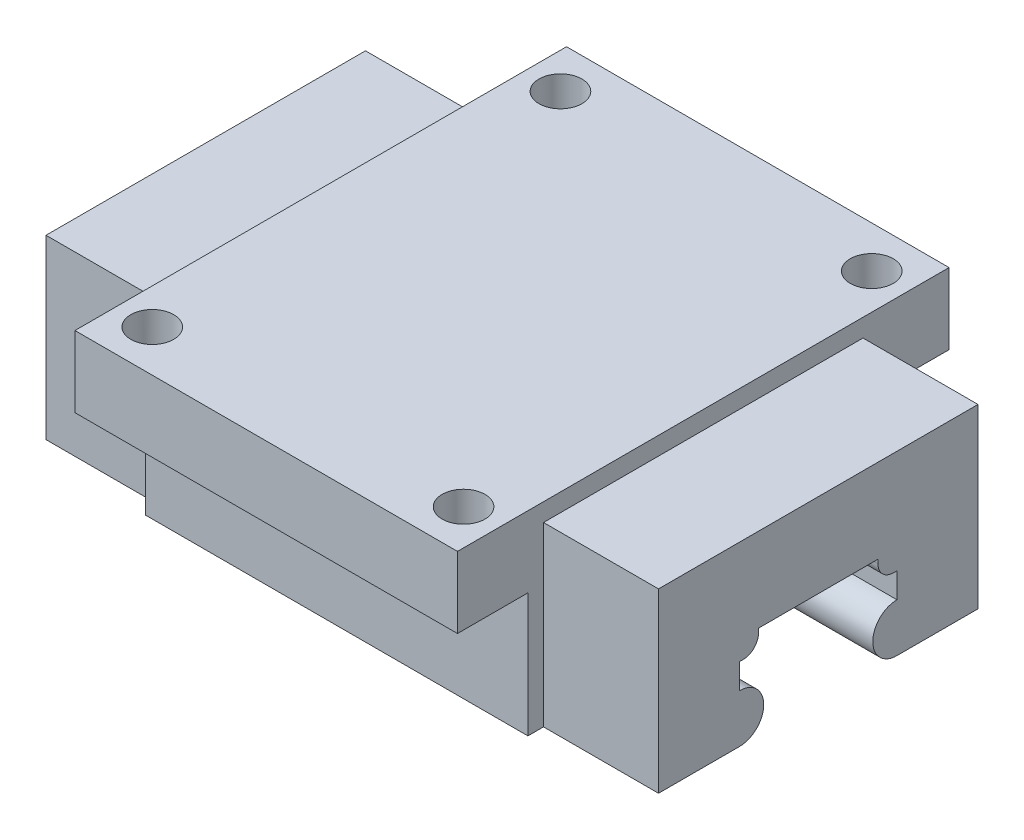
ISO-10303-21;
HEADER;
FILE_DESCRIPTION(('STEP AP214'),'2;1');
FILE_NAME('part.step','',(''),(''),'','','');
FILE_SCHEMA(('AUTOMOTIVE_DESIGN { 1 0 10303 214 1 1 1 1 }'));
ENDSEC;
DATA;
#1=APPLICATION_CONTEXT('core data for automotive mechanical design processes');
#2=APPLICATION_PROTOCOL_DEFINITION('international standard','automotive_design',2000,#1);
#3=PRODUCT_CONTEXT('',#1,'mechanical');
#4=PRODUCT('Part','Part','',(#3));
#5=PRODUCT_RELATED_PRODUCT_CATEGORY('part','',(#4));
#6=PRODUCT_DEFINITION_FORMATION('','',#4);
#7=PRODUCT_DEFINITION_CONTEXT('part definition',#1,'design');
#8=PRODUCT_DEFINITION('design','',#6,#7);
#9=PRODUCT_DEFINITION_SHAPE('','',#8);
#10=(LENGTH_UNIT() NAMED_UNIT(*) SI_UNIT(.MILLI.,.METRE.));
#11=(NAMED_UNIT(*) PLANE_ANGLE_UNIT() SI_UNIT($,.RADIAN.));
#12=(NAMED_UNIT(*) SI_UNIT($,.STERADIAN.) SOLID_ANGLE_UNIT());
#13=UNCERTAINTY_MEASURE_WITH_UNIT(LENGTH_MEASURE(1.E-05),#10,'distance_accuracy_value','');
#14=(GEOMETRIC_REPRESENTATION_CONTEXT(3) GLOBAL_UNCERTAINTY_ASSIGNED_CONTEXT((#13)) GLOBAL_UNIT_ASSIGNED_CONTEXT((#10,
#11,#12)) REPRESENTATION_CONTEXT('',''));
#15=CARTESIAN_POINT('',(0.,0.,0.));
#16=DIRECTION('',(0.,0.,1.));
#17=DIRECTION('',(1.,0.,0.));
#18=AXIS2_PLACEMENT_3D('',#15,#16,#17);
#19=CARTESIAN_POINT('',(-39.2554516235922,-25.,20.475));
#20=DIRECTION('',(0.,1.,0.));
#21=DIRECTION('',(0.,0.,1.));
#22=AXIS2_PLACEMENT_3D('',#19,#20,#21);
#23=PLANE('',#22);
#24=DIRECTION('',(0.,0.,1.));
#25=VECTOR('',#24,1.);
#26=CARTESIAN_POINT('',(-39.2554516235922,-25.,-20.475));
#27=LINE('',#26,#25);
#28=CARTESIAN_POINT('',(-39.2554516235922,-25.,10.0880170417424));
#29=VERTEX_POINT('',#28);
#30=CARTESIAN_POINT('',(-39.2554516235922,-25.,20.475));
#31=VERTEX_POINT('',#30);
#32=EDGE_CURVE('E372',#29,#31,#27,.T.);
#33=ORIENTED_EDGE('',*,*,#32,.F.);
#34=DIRECTION('',(-1.,0.,0.));
#35=VECTOR('',#34,1.);
#36=CARTESIAN_POINT('',(62.6895983399023,-25.,10.0880170417423));
#37=LINE('',#36,#35);
#38=CARTESIAN_POINT('',(39.2554516235922,-25.0000049471104,10.0880170417424));
#39=VERTEX_POINT('',#38);
#40=EDGE_CURVE('E294',#39,#29,#37,.T.);
#41=ORIENTED_EDGE('',*,*,#40,.F.);
#42=DIRECTION('',(0.,0.,-1.));
#43=VECTOR('',#42,1.);
#44=CARTESIAN_POINT('',(39.2554516235922,-25.,-20.475));
#45=LINE('',#44,#43);
#46=CARTESIAN_POINT('',(39.2554516235922,-25.,20.475));
#47=VERTEX_POINT('',#46);
#48=EDGE_CURVE('E240',#47,#39,#45,.T.);
#49=ORIENTED_EDGE('',*,*,#48,.F.);
#50=DIRECTION('',(1.,0.,0.));
#51=VECTOR('',#50,1.);
#52=CARTESIAN_POINT('',(24.5154516235922,-25.,20.475));
#53=LINE('',#52,#51);
#54=CARTESIAN_POINT('',(24.5154516235922,-25.,20.475));
#55=VERTEX_POINT('',#54);
#56=EDGE_CURVE('E380',#55,#47,#53,.T.);
#57=ORIENTED_EDGE('',*,*,#56,.F.);
#58=DIRECTION('',(0.,0.,-1.));
#59=VECTOR('',#58,1.);
#60=CARTESIAN_POINT('',(24.5154516235922,-25.,20.475));
#61=LINE('',#60,#59);
#62=CARTESIAN_POINT('',(24.5154516235922,-25.,22.475));
#63=VERTEX_POINT('',#62);
#64=EDGE_CURVE('E378',#63,#55,#61,.T.);
#65=ORIENTED_EDGE('',*,*,#64,.F.);
#66=DIRECTION('',(-1.,0.,0.));
#67=VECTOR('',#66,1.);
#68=CARTESIAN_POINT('',(42.783327800094,-25.,22.475));
#69=LINE('',#68,#67);
#70=CARTESIAN_POINT('',(-24.5154516235922,-25.,22.475));
#71=VERTEX_POINT('',#70);
#72=EDGE_CURVE('E303',#63,#71,#69,.T.);
#73=ORIENTED_EDGE('',*,*,#72,.T.);
#74=DIRECTION('',(0.,0.,1.));
#75=VECTOR('',#74,1.);
#76=CARTESIAN_POINT('',(-24.5154516235922,-25.,20.475));
#77=LINE('',#76,#75);
#78=CARTESIAN_POINT('',(-24.5154516235922,-25.,20.475));
#79=VERTEX_POINT('',#78);
#80=EDGE_CURVE('E375',#79,#71,#77,.T.);
#81=ORIENTED_EDGE('',*,*,#80,.F.);
#82=DIRECTION('',(1.,0.,0.));
#83=VECTOR('',#82,1.);
#84=CARTESIAN_POINT('',(-39.2554516235922,-25.,20.475));
#85=LINE('',#84,#83);
#86=EDGE_CURVE('E371',#31,#79,#85,.T.);
#87=ORIENTED_EDGE('',*,*,#86,.F.);
#88=EDGE_LOOP('',(#33,#41,#49,#57,#65,#73,#81,#87));
#89=FACE_BOUND('',#88,.T.);
#90=ADVANCED_FACE('F31',(#89),#23,.F.);
#91=CARTESIAN_POINT('',(-39.2554516235922,-25.,-20.475));
#92=DIRECTION('',(-1.,0.,0.));
#93=DIRECTION('',(0.,0.,1.));
#94=AXIS2_PLACEMENT_3D('',#91,#92,#93);
#95=PLANE('',#94);
#96=CARTESIAN_POINT('',(-39.2554516235922,-21.9000049471104,10.0880170417424));
#97=DIRECTION('',(-1.,0.,0.));
#98=DIRECTION('',(0.,0.,1.));
#99=AXIS2_PLACEMENT_3D('',#96,#97,#98);
#100=CIRCLE('',#99,3.1);
#101=CARTESIAN_POINT('',(-39.2554516235922,-18.8000049471104,10.0880170417424));
#102=VERTEX_POINT('',#101);
#103=EDGE_CURVE('E234',#29,#102,#100,.F.);
#104=ORIENTED_EDGE('',*,*,#103,.F.);
#105=ORIENTED_EDGE('',*,*,#32,.T.);
#106=DIRECTION('',(0.,1.,0.));
#107=VECTOR('',#106,1.);
#108=CARTESIAN_POINT('',(-39.2554516235922,-25.,20.475));
#109=LINE('',#108,#107);
#110=CARTESIAN_POINT('',(-39.2554516235922,-2.31,20.475));
#111=VERTEX_POINT('',#110);
#112=EDGE_CURVE('E396',#31,#111,#109,.T.);
#113=ORIENTED_EDGE('',*,*,#112,.T.);
#114=DIRECTION('',(0.,0.,1.));
#115=VECTOR('',#114,1.);
#116=CARTESIAN_POINT('',(-39.2554516235922,-2.31,0.));
#117=LINE('',#116,#115);
#118=CARTESIAN_POINT('',(-39.2554516235922,-2.31,-20.475));
#119=VERTEX_POINT('',#118);
#120=EDGE_CURVE('E341',#119,#111,#117,.T.);
#121=ORIENTED_EDGE('',*,*,#120,.F.);
#122=DIRECTION('',(0.,1.,0.));
#123=VECTOR('',#122,1.);
#124=CARTESIAN_POINT('',(-39.2554516235922,-25.,-20.475));
#125=LINE('',#124,#123);
#126=CARTESIAN_POINT('',(-39.2554516235922,-25.,-20.475));
#127=VERTEX_POINT('',#126);
#128=EDGE_CURVE('E11',#127,#119,#125,.T.);
#129=ORIENTED_EDGE('',*,*,#128,.F.);
#130=CARTESIAN_POINT('',(-39.2554516235922,-25.,-10.0880289614156));
#131=VERTEX_POINT('',#130);
#132=EDGE_CURVE('E368',#127,#131,#27,.T.);
#133=ORIENTED_EDGE('',*,*,#132,.T.);
#134=CARTESIAN_POINT('',(-39.2554516235922,-21.9000049471104,-10.0880289614156));
#135=DIRECTION('',(-1.,0.,0.));
#136=DIRECTION('',(0.,0.,1.));
#137=AXIS2_PLACEMENT_3D('',#134,#135,#136);
#138=CIRCLE('',#137,3.1);
#139=CARTESIAN_POINT('',(-39.2554516235922,-18.8000049471104,-10.0880289614156));
#140=VERTEX_POINT('',#139);
#141=EDGE_CURVE('E48',#131,#140,#138,.T.);
#142=ORIENTED_EDGE('',*,*,#141,.T.);
#143=DIRECTION('',(0.,1.,0.));
#144=VECTOR('',#143,1.);
#145=CARTESIAN_POINT('',(-39.2554516235922,-50.2107297116077,-10.0880289614156));
#146=LINE('',#145,#144);
#147=CARTESIAN_POINT('',(-39.2554516235922,-15.5800049471104,-10.0880289614156));
#148=VERTEX_POINT('',#147);
#149=EDGE_CURVE('E278',#140,#148,#146,.T.);
#150=ORIENTED_EDGE('',*,*,#149,.T.);
#151=DIRECTION('',(0.,0.,-1.));
#152=VECTOR('',#151,1.);
#153=CARTESIAN_POINT('',(-39.2554516235922,-15.5800049471104,0.));
#154=LINE('',#153,#152);
#155=CARTESIAN_POINT('',(-39.2554516235922,-15.5800049471104,-9.68584375343997));
#156=VERTEX_POINT('',#155);
#157=EDGE_CURVE('E241',#156,#148,#154,.T.);
#158=ORIENTED_EDGE('',*,*,#157,.F.);
#159=CARTESIAN_POINT('',(-39.2554516235922,-13.5803442317604,-9.64900595375159));
#160=DIRECTION('',(-1.,0.,0.));
#161=DIRECTION('',(0.,0.,1.));
#162=AXIS2_PLACEMENT_3D('',#159,#160,#161);
#163=CIRCLE('',#162,2.);
#164=CARTESIAN_POINT('',(-39.2554516235922,-13.5803442317604,-7.64900595375159));
#165=VERTEX_POINT('',#164);
#166=EDGE_CURVE('E258',#156,#165,#163,.T.);
#167=ORIENTED_EDGE('',*,*,#166,.T.);
#168=DIRECTION('',(0.,-1.,0.));
#169=VECTOR('',#168,1.);
#170=CARTESIAN_POINT('',(-39.2554516235922,-50.2107297116077,-7.64900595375159));
#171=LINE('',#170,#169);
#172=CARTESIAN_POINT('',(-39.2554516235922,-13.0800049471104,-7.64900595375159));
#173=VERTEX_POINT('',#172);
#174=EDGE_CURVE('E244',#173,#165,#171,.T.);
#175=ORIENTED_EDGE('',*,*,#174,.F.);
#176=DIRECTION('',(0.,0.,1.));
#177=VECTOR('',#176,1.);
#178=CARTESIAN_POINT('',(-39.2554516235922,-13.0800049471104,0.));
#179=LINE('',#178,#177);
#180=CARTESIAN_POINT('',(-39.2554516235922,-13.0800049471104,7.64899403407833));
#181=VERTEX_POINT('',#180);
#182=EDGE_CURVE('E265',#173,#181,#179,.T.);
#183=ORIENTED_EDGE('',*,*,#182,.T.);
#184=DIRECTION('',(0.,-1.,0.));
#185=VECTOR('',#184,1.);
#186=CARTESIAN_POINT('',(-39.2554516235922,-50.2107297116077,7.64899403407833));
#187=LINE('',#186,#185);
#188=CARTESIAN_POINT('',(-39.2554516235922,-13.5803442317604,7.64899403407833));
#189=VERTEX_POINT('',#188);
#190=EDGE_CURVE('E287',#181,#189,#187,.T.);
#191=ORIENTED_EDGE('',*,*,#190,.T.);
#192=CARTESIAN_POINT('',(-39.2554516235922,-13.5803442317604,9.64899403407833));
#193=DIRECTION('',(-1.,0.,0.));
#194=DIRECTION('',(0.,0.,1.));
#195=AXIS2_PLACEMENT_3D('',#192,#193,#194);
#196=CIRCLE('',#195,2.);
#197=CARTESIAN_POINT('',(-39.2554516235922,-15.5800049471104,9.68583183376671));
#198=VERTEX_POINT('',#197);
#199=EDGE_CURVE('E807',#198,#189,#196,.F.);
#200=ORIENTED_EDGE('',*,*,#199,.F.);
#201=DIRECTION('',(0.,0.,1.));
#202=VECTOR('',#201,1.);
#203=CARTESIAN_POINT('',(-39.2554516235922,-15.5800049471104,0.));
#204=LINE('',#203,#202);
#205=CARTESIAN_POINT('',(-39.2554516235922,-15.5800049471104,10.0880170417424));
#206=VERTEX_POINT('',#205);
#207=EDGE_CURVE('E274',#198,#206,#204,.T.);
#208=ORIENTED_EDGE('',*,*,#207,.T.);
#209=DIRECTION('',(0.,1.,0.));
#210=VECTOR('',#209,1.);
#211=CARTESIAN_POINT('',(-39.2554516235922,-50.2107297116077,10.0880170417424));
#212=LINE('',#211,#210);
#213=EDGE_CURVE('E814',#102,#206,#212,.T.);
#214=ORIENTED_EDGE('',*,*,#213,.F.);
#215=EDGE_LOOP('',(#104,#105,#113,#121,#129,#133,#142,#150,#158,#167,#175,#183,#191,#200,#208,#214));
#216=FACE_BOUND('',#215,.T.);
#217=ADVANCED_FACE('F33',(#216),#95,.T.);
#218=CARTESIAN_POINT('',(-39.2554516235922,-25.,-20.475));
#219=DIRECTION('',(0.,0.,-1.));
#220=DIRECTION('',(-1.,0.,0.));
#221=AXIS2_PLACEMENT_3D('',#218,#219,#220);
#222=PLANE('',#221);
#223=ORIENTED_EDGE('',*,*,#128,.T.);
#224=DIRECTION('',(-1.,0.,0.));
#225=VECTOR('',#224,1.);
#226=CARTESIAN_POINT('',(-78.4434285294682,-2.31,-20.475));
#227=LINE('',#226,#225);
#228=CARTESIAN_POINT('',(-24.5154516235922,-2.31,-20.475));
#229=VERTEX_POINT('',#228);
#230=EDGE_CURVE('E339',#229,#119,#227,.T.);
#231=ORIENTED_EDGE('',*,*,#230,.F.);
#232=DIRECTION('',(0.,1.,0.));
#233=VECTOR('',#232,1.);
#234=CARTESIAN_POINT('',(-24.5154516235922,-25.,-20.475));
#235=LINE('',#234,#233);
#236=CARTESIAN_POINT('',(-24.5154516235922,-25.,-20.475));
#237=VERTEX_POINT('',#236);
#238=EDGE_CURVE('E40',#237,#229,#235,.T.);
#239=ORIENTED_EDGE('',*,*,#238,.F.);
#240=DIRECTION('',(-1.,0.,0.));
#241=VECTOR('',#240,1.);
#242=CARTESIAN_POINT('',(-39.2554516235922,-25.,-20.475));
#243=LINE('',#242,#241);
#244=EDGE_CURVE('E393',#237,#127,#243,.T.);
#245=ORIENTED_EDGE('',*,*,#244,.T.);
#246=EDGE_LOOP('',(#223,#231,#239,#245));
#247=FACE_BOUND('',#246,.T.);
#248=ADVANCED_FACE('F508',(#247),#222,.T.);
#249=CARTESIAN_POINT('',(-39.2554516235922,-25.,20.475));
#250=DIRECTION('',(0.,0.,1.));
#251=DIRECTION('',(1.,0.,0.));
#252=AXIS2_PLACEMENT_3D('',#249,#250,#251);
#253=PLANE('',#252);
#254=DIRECTION('',(0.,1.,0.));
#255=VECTOR('',#254,1.);
#256=CARTESIAN_POINT('',(-24.5154516235922,-25.,20.475));
#257=LINE('',#256,#255);
#258=CARTESIAN_POINT('',(-24.5154516235922,-2.31,20.475));
#259=VERTEX_POINT('',#258);
#260=EDGE_CURVE('E430',#79,#259,#257,.T.);
#261=ORIENTED_EDGE('',*,*,#260,.T.);
#262=DIRECTION('',(1.,0.,0.));
#263=VECTOR('',#262,1.);
#264=CARTESIAN_POINT('',(-78.4434285294682,-2.31,20.475));
#265=LINE('',#264,#263);
#266=EDGE_CURVE('E343',#111,#259,#265,.T.);
#267=ORIENTED_EDGE('',*,*,#266,.F.);
#268=ORIENTED_EDGE('',*,*,#112,.F.);
#269=ORIENTED_EDGE('',*,*,#86,.T.);
#270=EDGE_LOOP('',(#261,#267,#268,#269));
#271=FACE_BOUND('',#270,.T.);
#272=ADVANCED_FACE('F461',(#271),#253,.T.);
#273=CARTESIAN_POINT('',(-39.2554516235922,0.,20.475));
#274=DIRECTION('',(0.,1.,0.));
#275=DIRECTION('',(0.,0.,1.));
#276=AXIS2_PLACEMENT_3D('',#273,#274,#275);
#277=PLANE('',#276);
#278=CARTESIAN_POINT('',(-19.9504516235922,0.,-26.16));
#279=DIRECTION('',(0.,1.,0.));
#280=DIRECTION('',(0.,0.,1.));
#281=AXIS2_PLACEMENT_3D('',#278,#279,#280);
#282=CIRCLE('',#281,2.75);
#283=CARTESIAN_POINT('',(-19.9504516235922,0.,-23.41));
#284=VERTEX_POINT('',#283);
#285=EDGE_CURVE('E364',#284,#284,#282,.T.);
#286=ORIENTED_EDGE('',*,*,#285,.F.);
#287=EDGE_LOOP('',(#286));
#288=FACE_BOUND('',#287,.T.);
#289=CARTESIAN_POINT('',(19.9504516235922,0.,-26.16));
#290=DIRECTION('',(0.,1.,0.));
#291=DIRECTION('',(0.,0.,-1.));
#292=AXIS2_PLACEMENT_3D('',#289,#290,#291);
#293=CIRCLE('',#292,2.75);
#294=CARTESIAN_POINT('',(19.9504516235922,0.,-28.91));
#295=VERTEX_POINT('',#294);
#296=EDGE_CURVE('E361',#295,#295,#293,.T.);
#297=ORIENTED_EDGE('',*,*,#296,.F.);
#298=EDGE_LOOP('',(#297));
#299=FACE_BOUND('',#298,.T.);
#300=CARTESIAN_POINT('',(19.9504516235922,0.,26.16));
#301=DIRECTION('',(0.,1.,0.));
#302=DIRECTION('',(0.,0.,1.));
#303=AXIS2_PLACEMENT_3D('',#300,#301,#302);
#304=CIRCLE('',#303,2.75);
#305=CARTESIAN_POINT('',(19.9504516235922,0.,28.91));
#306=VERTEX_POINT('',#305);
#307=EDGE_CURVE('E358',#306,#306,#304,.T.);
#308=ORIENTED_EDGE('',*,*,#307,.F.);
#309=EDGE_LOOP('',(#308));
#310=FACE_BOUND('',#309,.T.);
#311=CARTESIAN_POINT('',(-19.9504516235922,0.,26.16));
#312=DIRECTION('',(0.,1.,0.));
#313=DIRECTION('',(0.,0.,-1.));
#314=AXIS2_PLACEMENT_3D('',#311,#312,#313);
#315=CIRCLE('',#314,2.75);
#316=CARTESIAN_POINT('',(-19.9504516235922,0.,23.41));
#317=VERTEX_POINT('',#316);
#318=EDGE_CURVE('E355',#317,#317,#315,.T.);
#319=ORIENTED_EDGE('',*,*,#318,.F.);
#320=EDGE_LOOP('',(#319));
#321=FACE_BOUND('',#320,.T.);
#322=DIRECTION('',(0.,0.,1.));
#323=VECTOR('',#322,1.);
#324=CARTESIAN_POINT('',(-24.5154516235922,0.,-31.505));
#325=LINE('',#324,#323);
#326=CARTESIAN_POINT('',(-24.5154516235922,0.,-31.505));
#327=VERTEX_POINT('',#326);
#328=CARTESIAN_POINT('',(-24.5154516235922,0.,31.505));
#329=VERTEX_POINT('',#328);
#330=EDGE_CURVE('E405',#327,#329,#325,.T.);
#331=ORIENTED_EDGE('',*,*,#330,.T.);
#332=DIRECTION('',(1.,0.,0.));
#333=VECTOR('',#332,1.);
#334=CARTESIAN_POINT('',(-24.5154516235922,0.,31.505));
#335=LINE('',#334,#333);
#336=CARTESIAN_POINT('',(24.5154516235922,0.,31.505));
#337=VERTEX_POINT('',#336);
#338=EDGE_CURVE('E367',#329,#337,#335,.T.);
#339=ORIENTED_EDGE('',*,*,#338,.T.);
#340=DIRECTION('',(0.,0.,-1.));
#341=VECTOR('',#340,1.);
#342=CARTESIAN_POINT('',(24.5154516235922,0.,-31.505));
#343=LINE('',#342,#341);
#344=CARTESIAN_POINT('',(24.5154516235922,0.,-31.505));
#345=VERTEX_POINT('',#344);
#346=EDGE_CURVE('E399',#337,#345,#343,.T.);
#347=ORIENTED_EDGE('',*,*,#346,.T.);
#348=DIRECTION('',(-1.,0.,0.));
#349=VECTOR('',#348,1.);
#350=CARTESIAN_POINT('',(-24.5154516235922,0.,-31.505));
#351=LINE('',#350,#349);
#352=EDGE_CURVE('E402',#345,#327,#351,.T.);
#353=ORIENTED_EDGE('',*,*,#352,.T.);
#354=EDGE_LOOP('',(#331,#339,#347,#353));
#355=FACE_BOUND('',#354,.T.);
#356=ADVANCED_FACE('F457',(#288,#299,#310,#321,#355),#277,.T.);
#357=CARTESIAN_POINT('',(24.5154516235922,-25.,-20.475));
#358=DIRECTION('',(0.,0.,-1.));
#359=DIRECTION('',(-1.,0.,0.));
#360=AXIS2_PLACEMENT_3D('',#357,#358,#359);
#361=PLANE('',#360);
#362=DIRECTION('',(0.,1.,0.));
#363=VECTOR('',#362,1.);
#364=CARTESIAN_POINT('',(24.5154516235922,-25.,-20.475));
#365=LINE('',#364,#363);
#366=CARTESIAN_POINT('',(24.5154516235922,-25.,-20.475));
#367=VERTEX_POINT('',#366);
#368=CARTESIAN_POINT('',(24.5154516235922,-2.31,-20.475));
#369=VERTEX_POINT('',#368);
#370=EDGE_CURVE('E414',#367,#369,#365,.T.);
#371=ORIENTED_EDGE('',*,*,#370,.T.);
#372=DIRECTION('',(-1.,0.,0.));
#373=VECTOR('',#372,1.);
#374=CARTESIAN_POINT('',(-78.4434285294682,-2.31,-20.475));
#375=LINE('',#374,#373);
#376=CARTESIAN_POINT('',(39.2554516235922,-2.31,-20.475));
#377=VERTEX_POINT('',#376);
#378=EDGE_CURVE('E346',#377,#369,#375,.T.);
#379=ORIENTED_EDGE('',*,*,#378,.F.);
#380=DIRECTION('',(0.,1.,0.));
#381=VECTOR('',#380,1.);
#382=CARTESIAN_POINT('',(39.2554516235922,-25.,-20.475));
#383=LINE('',#382,#381);
#384=CARTESIAN_POINT('',(39.2554516235922,-25.,-20.475));
#385=VERTEX_POINT('',#384);
#386=EDGE_CURVE('E417',#385,#377,#383,.T.);
#387=ORIENTED_EDGE('',*,*,#386,.F.);
#388=DIRECTION('',(-1.,0.,0.));
#389=VECTOR('',#388,1.);
#390=CARTESIAN_POINT('',(24.5154516235922,-25.,-20.475));
#391=LINE('',#390,#389);
#392=EDGE_CURVE('E385',#385,#367,#391,.T.);
#393=ORIENTED_EDGE('',*,*,#392,.T.);
#394=EDGE_LOOP('',(#371,#379,#387,#393));
#395=FACE_BOUND('',#394,.T.);
#396=ADVANCED_FACE('F460',(#395),#361,.T.);
#397=CARTESIAN_POINT('',(39.2554516235922,-25.,-20.475));
#398=DIRECTION('',(1.,0.,0.));
#399=DIRECTION('',(0.,0.,-1.));
#400=AXIS2_PLACEMENT_3D('',#397,#398,#399);
#401=PLANE('',#400);
#402=CARTESIAN_POINT('',(39.2554516235922,-21.9000049471104,10.0880170417423));
#403=DIRECTION('',(1.,0.,0.));
#404=DIRECTION('',(0.,0.,-1.));
#405=AXIS2_PLACEMENT_3D('',#402,#403,#404);
#406=CIRCLE('',#405,3.1);
#407=CARTESIAN_POINT('',(39.2554516235922,-18.8000049471104,10.0880170417423));
#408=VERTEX_POINT('',#407);
#409=EDGE_CURVE('E231',#39,#408,#406,.T.);
#410=ORIENTED_EDGE('',*,*,#409,.T.);
#411=DIRECTION('',(0.,1.,0.));
#412=VECTOR('',#411,1.);
#413=CARTESIAN_POINT('',(39.2554516235922,-50.2107297116077,10.0880170417423));
#414=LINE('',#413,#412);
#415=CARTESIAN_POINT('',(39.2554516235922,-15.5800049471104,10.0880170417423));
#416=VERTEX_POINT('',#415);
#417=EDGE_CURVE('E218',#408,#416,#414,.T.);
#418=ORIENTED_EDGE('',*,*,#417,.T.);
#419=DIRECTION('',(0.,0.,1.));
#420=VECTOR('',#419,1.);
#421=CARTESIAN_POINT('',(39.2554516235922,-15.5800049471104,0.));
#422=LINE('',#421,#420);
#423=CARTESIAN_POINT('',(39.2554516235922,-15.5800049471104,9.68583183376669));
#424=VERTEX_POINT('',#423);
#425=EDGE_CURVE('E269',#424,#416,#422,.T.);
#426=ORIENTED_EDGE('',*,*,#425,.F.);
#427=CARTESIAN_POINT('',(39.2554516235922,-13.5803442317604,9.64899403407832));
#428=DIRECTION('',(1.,0.,0.));
#429=DIRECTION('',(0.,0.,-1.));
#430=AXIS2_PLACEMENT_3D('',#427,#428,#429);
#431=CIRCLE('',#430,2.);
#432=CARTESIAN_POINT('',(39.2554516235922,-13.5803442317604,7.64899403407832));
#433=VERTEX_POINT('',#432);
#434=EDGE_CURVE('E270',#424,#433,#431,.T.);
#435=ORIENTED_EDGE('',*,*,#434,.T.);
#436=DIRECTION('',(0.,-1.,0.));
#437=VECTOR('',#436,1.);
#438=CARTESIAN_POINT('',(39.2554516235922,-50.2107297116077,7.64899403407832));
#439=LINE('',#438,#437);
#440=CARTESIAN_POINT('',(39.2554516235922,-13.0800049471104,7.64899403407832));
#441=VERTEX_POINT('',#440);
#442=EDGE_CURVE('E267',#441,#433,#439,.T.);
#443=ORIENTED_EDGE('',*,*,#442,.F.);
#444=DIRECTION('',(0.,0.,1.));
#445=VECTOR('',#444,1.);
#446=CARTESIAN_POINT('',(39.2554516235922,-13.0800049471104,0.));
#447=LINE('',#446,#445);
#448=CARTESIAN_POINT('',(39.2554516235922,-13.0800049471104,-7.64900595375161));
#449=VERTEX_POINT('',#448);
#450=EDGE_CURVE('E260',#449,#441,#447,.T.);
#451=ORIENTED_EDGE('',*,*,#450,.F.);
#452=DIRECTION('',(0.,-1.,0.));
#453=VECTOR('',#452,1.);
#454=CARTESIAN_POINT('',(39.2554516235922,-50.2107297116077,-7.6490059537516));
#455=LINE('',#454,#453);
#456=CARTESIAN_POINT('',(39.2554516235922,-13.5803442317604,-7.6490059537516));
#457=VERTEX_POINT('',#456);
#458=EDGE_CURVE('E261',#449,#457,#455,.T.);
#459=ORIENTED_EDGE('',*,*,#458,.T.);
#460=CARTESIAN_POINT('',(39.2554516235922,-13.5803442317604,-9.64900595375161));
#461=DIRECTION('',(1.,0.,0.));
#462=DIRECTION('',(0.,0.,-1.));
#463=AXIS2_PLACEMENT_3D('',#460,#461,#462);
#464=CIRCLE('',#463,2.);
#465=CARTESIAN_POINT('',(39.2554516235922,-15.5800049471104,-9.68584375343998));
#466=VERTEX_POINT('',#465);
#467=EDGE_CURVE('E253',#466,#457,#464,.F.);
#468=ORIENTED_EDGE('',*,*,#467,.F.);
#469=DIRECTION('',(0.,0.,-1.));
#470=VECTOR('',#469,1.);
#471=CARTESIAN_POINT('',(39.2554516235922,-15.5800049471104,0.));
#472=LINE('',#471,#470);
#473=CARTESIAN_POINT('',(39.2554516235922,-15.5800049471104,-10.0880289614156));
#474=VERTEX_POINT('',#473);
#475=EDGE_CURVE('E254',#466,#474,#472,.T.);
#476=ORIENTED_EDGE('',*,*,#475,.T.);
#477=DIRECTION('',(0.,1.,0.));
#478=VECTOR('',#477,1.);
#479=CARTESIAN_POINT('',(39.2554516235922,-50.2107297116077,-10.0880289614156));
#480=LINE('',#479,#478);
#481=CARTESIAN_POINT('',(39.2554516235922,-18.8000049471104,-10.0880289614156));
#482=VERTEX_POINT('',#481);
#483=EDGE_CURVE('E251',#482,#474,#480,.T.);
#484=ORIENTED_EDGE('',*,*,#483,.F.);
#485=CARTESIAN_POINT('',(39.2554516235922,-21.9000049471104,-10.0880289614156));
#486=DIRECTION('',(1.,0.,0.));
#487=DIRECTION('',(0.,0.,-1.));
#488=AXIS2_PLACEMENT_3D('',#485,#486,#487);
#489=CIRCLE('',#488,3.1);
#490=CARTESIAN_POINT('',(39.2554516235922,-25.0000049471104,-10.0880289614156));
#491=VERTEX_POINT('',#490);
#492=EDGE_CURVE('E249',#491,#482,#489,.F.);
#493=ORIENTED_EDGE('',*,*,#492,.F.);
#494=EDGE_CURVE('E383',#491,#385,#45,.T.);
#495=ORIENTED_EDGE('',*,*,#494,.T.);
#496=ORIENTED_EDGE('',*,*,#386,.T.);
#497=DIRECTION('',(0.,0.,-1.));
#498=VECTOR('',#497,1.);
#499=CARTESIAN_POINT('',(39.2554516235922,-2.31,0.));
#500=LINE('',#499,#498);
#501=CARTESIAN_POINT('',(39.2554516235922,-2.31,20.475));
#502=VERTEX_POINT('',#501);
#503=EDGE_CURVE('E353',#502,#377,#500,.T.);
#504=ORIENTED_EDGE('',*,*,#503,.F.);
#505=DIRECTION('',(0.,1.,0.));
#506=VECTOR('',#505,1.);
#507=CARTESIAN_POINT('',(39.2554516235922,-25.,20.475));
#508=LINE('',#507,#506);
#509=EDGE_CURVE('E420',#47,#502,#508,.T.);
#510=ORIENTED_EDGE('',*,*,#509,.F.);
#511=ORIENTED_EDGE('',*,*,#48,.T.);
#512=EDGE_LOOP('',(#410,#418,#426,#435,#443,#451,#459,#468,#476,#484,#493,#495,#496,#504,#510,#511));
#513=FACE_BOUND('',#512,.T.);
#514=ADVANCED_FACE('F238',(#513),#401,.T.);
#515=CARTESIAN_POINT('',(24.5154516235922,-25.,20.475));
#516=DIRECTION('',(0.,0.,1.));
#517=DIRECTION('',(1.,0.,0.));
#518=AXIS2_PLACEMENT_3D('',#515,#516,#517);
#519=PLANE('',#518);
#520=ORIENTED_EDGE('',*,*,#509,.T.);
#521=DIRECTION('',(1.,0.,0.));
#522=VECTOR('',#521,1.);
#523=CARTESIAN_POINT('',(-78.4434285294682,-2.31,20.475));
#524=LINE('',#523,#522);
#525=CARTESIAN_POINT('',(24.5154516235922,-2.31,20.475));
#526=VERTEX_POINT('',#525);
#527=EDGE_CURVE('E351',#526,#502,#524,.T.);
#528=ORIENTED_EDGE('',*,*,#527,.F.);
#529=DIRECTION('',(0.,1.,0.));
#530=VECTOR('',#529,1.);
#531=CARTESIAN_POINT('',(24.5154516235922,-25.,20.475));
#532=LINE('',#531,#530);
#533=EDGE_CURVE('E423',#55,#526,#532,.T.);
#534=ORIENTED_EDGE('',*,*,#533,.F.);
#535=ORIENTED_EDGE('',*,*,#56,.T.);
#536=EDGE_LOOP('',(#520,#528,#534,#535));
#537=FACE_BOUND('',#536,.T.);
#538=ADVANCED_FACE('F527',(#537),#519,.T.);
#539=CARTESIAN_POINT('',(-24.5154516235922,-25.,-31.505));
#540=DIRECTION('',(-1.,0.,0.));
#541=DIRECTION('',(0.,0.,1.));
#542=AXIS2_PLACEMENT_3D('',#539,#540,#541);
#543=PLANE('',#542);
#544=DIRECTION('',(0.,-1.,0.));
#545=VECTOR('',#544,1.);
#546=CARTESIAN_POINT('',(-24.5154516235922,-25.,22.475));
#547=LINE('',#546,#545);
#548=CARTESIAN_POINT('',(-24.5154516235922,-9.12,22.475));
#549=VERTEX_POINT('',#548);
#550=EDGE_CURVE('E56',#549,#71,#547,.T.);
#551=ORIENTED_EDGE('',*,*,#550,.F.);
#552=DIRECTION('',(0.,0.,-1.));
#553=VECTOR('',#552,1.);
#554=CARTESIAN_POINT('',(-24.5154516235922,-9.12,22.475));
#555=LINE('',#554,#553);
#556=CARTESIAN_POINT('',(-24.5154516235922,-9.12,31.505));
#557=VERTEX_POINT('',#556);
#558=EDGE_CURVE('E296',#557,#549,#555,.T.);
#559=ORIENTED_EDGE('',*,*,#558,.F.);
#560=DIRECTION('',(0.,1.,0.));
#561=VECTOR('',#560,1.);
#562=CARTESIAN_POINT('',(-24.5154516235922,-25.,31.505));
#563=LINE('',#562,#561);
#564=EDGE_CURVE('E428',#557,#329,#563,.T.);
#565=ORIENTED_EDGE('',*,*,#564,.T.);
#566=ORIENTED_EDGE('',*,*,#330,.F.);
#567=DIRECTION('',(0.,1.,0.));
#568=VECTOR('',#567,1.);
#569=CARTESIAN_POINT('',(-24.5154516235922,-25.,-31.505));
#570=LINE('',#569,#568);
#571=CARTESIAN_POINT('',(-24.5154516235922,-9.12,-31.505));
#572=VERTEX_POINT('',#571);
#573=EDGE_CURVE('E410',#572,#327,#570,.T.);
#574=ORIENTED_EDGE('',*,*,#573,.F.);
#575=DIRECTION('',(0.,0.,-1.));
#576=VECTOR('',#575,1.);
#577=CARTESIAN_POINT('',(-24.5154516235922,-9.12,-22.475));
#578=LINE('',#577,#576);
#579=CARTESIAN_POINT('',(-24.5154516235922,-9.12,-22.475));
#580=VERTEX_POINT('',#579);
#581=EDGE_CURVE('E316',#580,#572,#578,.T.);
#582=ORIENTED_EDGE('',*,*,#581,.F.);
#583=DIRECTION('',(0.,1.,0.));
#584=VECTOR('',#583,1.);
#585=CARTESIAN_POINT('',(-24.5154516235922,-25.,-22.475));
#586=LINE('',#585,#584);
#587=CARTESIAN_POINT('',(-24.5154516235922,-25.,-22.475));
#588=VERTEX_POINT('',#587);
#589=EDGE_CURVE('E315',#588,#580,#586,.T.);
#590=ORIENTED_EDGE('',*,*,#589,.F.);
#591=DIRECTION('',(0.,0.,1.));
#592=VECTOR('',#591,1.);
#593=CARTESIAN_POINT('',(-24.5154516235922,-25.,-31.505));
#594=LINE('',#593,#592);
#595=EDGE_CURVE('E391',#588,#237,#594,.T.);
#596=ORIENTED_EDGE('',*,*,#595,.T.);
#597=ORIENTED_EDGE('',*,*,#238,.T.);
#598=DIRECTION('',(0.,0.,1.));
#599=VECTOR('',#598,1.);
#600=CARTESIAN_POINT('',(-24.5154516235922,-2.31,0.));
#601=LINE('',#600,#599);
#602=EDGE_CURVE('E337',#229,#259,#601,.T.);
#603=ORIENTED_EDGE('',*,*,#602,.T.);
#604=ORIENTED_EDGE('',*,*,#260,.F.);
#605=ORIENTED_EDGE('',*,*,#80,.T.);
#606=EDGE_LOOP('',(#551,#559,#565,#566,#574,#582,#590,#596,#597,#603,#604,#605));
#607=FACE_BOUND('',#606,.T.);
#608=ADVANCED_FACE('F486',(#607),#543,.T.);
#609=CARTESIAN_POINT('',(-24.5154516235922,-25.,-31.505));
#610=DIRECTION('',(0.,0.,-1.));
#611=DIRECTION('',(-1.,0.,0.));
#612=AXIS2_PLACEMENT_3D('',#609,#610,#611);
#613=PLANE('',#612);
#614=DIRECTION('',(-1.,0.,0.));
#615=VECTOR('',#614,1.);
#616=CARTESIAN_POINT('',(42.7833278000939,-9.12,-31.505));
#617=LINE('',#616,#615);
#618=CARTESIAN_POINT('',(24.5154516235922,-9.12,-31.505));
#619=VERTEX_POINT('',#618);
#620=EDGE_CURVE('E324',#619,#572,#617,.T.);
#621=ORIENTED_EDGE('',*,*,#620,.T.);
#622=ORIENTED_EDGE('',*,*,#573,.T.);
#623=ORIENTED_EDGE('',*,*,#352,.F.);
#624=DIRECTION('',(0.,1.,0.));
#625=VECTOR('',#624,1.);
#626=CARTESIAN_POINT('',(24.5154516235922,-25.,-31.505));
#627=LINE('',#626,#625);
#628=EDGE_CURVE('E412',#619,#345,#627,.T.);
#629=ORIENTED_EDGE('',*,*,#628,.F.);
#630=EDGE_LOOP('',(#621,#622,#623,#629));
#631=FACE_BOUND('',#630,.T.);
#632=ADVANCED_FACE('F484',(#631),#613,.T.);
#633=CARTESIAN_POINT('',(24.5154516235922,-25.,-31.505));
#634=DIRECTION('',(1.,0.,0.));
#635=DIRECTION('',(0.,0.,-1.));
#636=AXIS2_PLACEMENT_3D('',#633,#634,#635);
#637=PLANE('',#636);
#638=DIRECTION('',(0.,-1.,0.));
#639=VECTOR('',#638,1.);
#640=CARTESIAN_POINT('',(24.5154516235922,-25.,22.475));
#641=LINE('',#640,#639);
#642=CARTESIAN_POINT('',(24.5154516235922,-9.12,22.475));
#643=VERTEX_POINT('',#642);
#644=EDGE_CURVE('E298',#643,#63,#641,.T.);
#645=ORIENTED_EDGE('',*,*,#644,.T.);
#646=ORIENTED_EDGE('',*,*,#64,.T.);
#647=ORIENTED_EDGE('',*,*,#533,.T.);
#648=DIRECTION('',(0.,0.,1.));
#649=VECTOR('',#648,1.);
#650=CARTESIAN_POINT('',(24.5154516235922,-2.31,0.));
#651=LINE('',#650,#649);
#652=EDGE_CURVE('E349',#369,#526,#651,.T.);
#653=ORIENTED_EDGE('',*,*,#652,.F.);
#654=ORIENTED_EDGE('',*,*,#370,.F.);
#655=DIRECTION('',(0.,0.,-1.));
#656=VECTOR('',#655,1.);
#657=CARTESIAN_POINT('',(24.5154516235922,-25.,-31.505));
#658=LINE('',#657,#656);
#659=CARTESIAN_POINT('',(24.5154516235922,-25.,-22.475));
#660=VERTEX_POINT('',#659);
#661=EDGE_CURVE('E388',#367,#660,#658,.T.);
#662=ORIENTED_EDGE('',*,*,#661,.T.);
#663=DIRECTION('',(0.,1.,0.));
#664=VECTOR('',#663,1.);
#665=CARTESIAN_POINT('',(24.5154516235922,-25.,-22.475));
#666=LINE('',#665,#664);
#667=CARTESIAN_POINT('',(24.5154516235922,-9.12,-22.475));
#668=VERTEX_POINT('',#667);
#669=EDGE_CURVE('E326',#660,#668,#666,.T.);
#670=ORIENTED_EDGE('',*,*,#669,.T.);
#671=DIRECTION('',(0.,0.,-1.));
#672=VECTOR('',#671,1.);
#673=CARTESIAN_POINT('',(24.5154516235922,-9.12,-22.4750000000001));
#674=LINE('',#673,#672);
#675=EDGE_CURVE('E321',#668,#619,#674,.T.);
#676=ORIENTED_EDGE('',*,*,#675,.T.);
#677=ORIENTED_EDGE('',*,*,#628,.T.);
#678=ORIENTED_EDGE('',*,*,#346,.F.);
#679=DIRECTION('',(0.,1.,0.));
#680=VECTOR('',#679,1.);
#681=CARTESIAN_POINT('',(24.5154516235922,-25.,31.505));
#682=LINE('',#681,#680);
#683=CARTESIAN_POINT('',(24.5154516235922,-9.12,31.505));
#684=VERTEX_POINT('',#683);
#685=EDGE_CURVE('E426',#684,#337,#682,.T.);
#686=ORIENTED_EDGE('',*,*,#685,.F.);
#687=DIRECTION('',(0.,0.,-1.));
#688=VECTOR('',#687,1.);
#689=CARTESIAN_POINT('',(24.5154516235922,-9.12,22.475));
#690=LINE('',#689,#688);
#691=EDGE_CURVE('E304',#684,#643,#690,.T.);
#692=ORIENTED_EDGE('',*,*,#691,.T.);
#693=EDGE_LOOP('',(#645,#646,#647,#653,#654,#662,#670,#676,#677,#678,#686,#692));
#694=FACE_BOUND('',#693,.T.);
#695=ADVANCED_FACE('F481',(#694),#637,.T.);
#696=CARTESIAN_POINT('',(-24.5154516235922,-25.,31.505));
#697=DIRECTION('',(0.,0.,1.));
#698=DIRECTION('',(1.,0.,0.));
#699=AXIS2_PLACEMENT_3D('',#696,#697,#698);
#700=PLANE('',#699);
#701=DIRECTION('',(-1.,0.,0.));
#702=VECTOR('',#701,1.);
#703=CARTESIAN_POINT('',(42.783327800094,-9.12,31.505));
#704=LINE('',#703,#702);
#705=EDGE_CURVE('E308',#684,#557,#704,.T.);
#706=ORIENTED_EDGE('',*,*,#705,.F.);
#707=ORIENTED_EDGE('',*,*,#685,.T.);
#708=ORIENTED_EDGE('',*,*,#338,.F.);
#709=ORIENTED_EDGE('',*,*,#564,.F.);
#710=EDGE_LOOP('',(#706,#707,#708,#709));
#711=FACE_BOUND('',#710,.T.);
#712=ADVANCED_FACE('F477',(#711),#700,.T.);
#713=ORIENTED_EDGE('',*,*,#494,.F.);
#714=DIRECTION('',(-1.,0.,0.));
#715=VECTOR('',#714,1.);
#716=CARTESIAN_POINT('',(62.6895983399023,-25.,-10.0880289614156));
#717=LINE('',#716,#715);
#718=EDGE_CURVE('E276',#491,#131,#717,.T.);
#719=ORIENTED_EDGE('',*,*,#718,.T.);
#720=ORIENTED_EDGE('',*,*,#132,.F.);
#721=ORIENTED_EDGE('',*,*,#244,.F.);
#722=ORIENTED_EDGE('',*,*,#595,.F.);
#723=DIRECTION('',(-1.,0.,0.));
#724=VECTOR('',#723,1.);
#725=CARTESIAN_POINT('',(42.7833278000939,-25.,-22.4750000000001));
#726=LINE('',#725,#724);
#727=EDGE_CURVE('E318',#660,#588,#726,.T.);
#728=ORIENTED_EDGE('',*,*,#727,.F.);
#729=ORIENTED_EDGE('',*,*,#661,.F.);
#730=ORIENTED_EDGE('',*,*,#392,.F.);
#731=EDGE_LOOP('',(#713,#719,#720,#721,#722,#728,#729,#730));
#732=FACE_BOUND('',#731,.T.);
#733=ADVANCED_FACE('F453',(#732),#23,.F.);
#734=CARTESIAN_POINT('',(-19.9504516235922,-25.,-26.16));
#735=DIRECTION('',(0.,1.,0.));
#736=DIRECTION('',(0.,0.,1.));
#737=AXIS2_PLACEMENT_3D('',#734,#735,#736);
#738=CYLINDRICAL_SURFACE('',#737,2.75);
#739=CARTESIAN_POINT('',(-19.9504516235922,-9.12,-26.16));
#740=DIRECTION('',(0.,1.,0.));
#741=DIRECTION('',(0.,0.,1.));
#742=AXIS2_PLACEMENT_3D('',#739,#740,#741);
#743=CIRCLE('',#742,2.75);
#744=CARTESIAN_POINT('',(-19.9504516235922,-9.12,-23.41));
#745=VERTEX_POINT('',#744);
#746=EDGE_CURVE('E334',#745,#745,#743,.F.);
#747=ORIENTED_EDGE('',*,*,#746,.T.);
#748=EDGE_LOOP('',(#747));
#749=FACE_BOUND('',#748,.T.);
#750=ORIENTED_EDGE('',*,*,#285,.T.);
#751=EDGE_LOOP('',(#750));
#752=FACE_BOUND('',#751,.T.);
#753=ADVANCED_FACE('F450',(#749,#752),#738,.F.);
#754=CARTESIAN_POINT('',(19.9504516235922,-25.,-26.16));
#755=DIRECTION('',(0.,1.,0.));
#756=DIRECTION('',(0.,0.,1.));
#757=AXIS2_PLACEMENT_3D('',#754,#755,#756);
#758=CYLINDRICAL_SURFACE('',#757,2.75);
#759=CARTESIAN_POINT('',(19.9504516235922,-9.12,-26.16));
#760=DIRECTION('',(0.,1.,0.));
#761=DIRECTION('',(0.,0.,1.));
#762=AXIS2_PLACEMENT_3D('',#759,#760,#761);
#763=CIRCLE('',#762,2.75);
#764=CARTESIAN_POINT('',(19.9504516235922,-9.12,-23.41));
#765=VERTEX_POINT('',#764);
#766=EDGE_CURVE('E331',#765,#765,#763,.F.);
#767=ORIENTED_EDGE('',*,*,#766,.T.);
#768=EDGE_LOOP('',(#767));
#769=FACE_BOUND('',#768,.T.);
#770=ORIENTED_EDGE('',*,*,#296,.T.);
#771=EDGE_LOOP('',(#770));
#772=FACE_BOUND('',#771,.T.);
#773=ADVANCED_FACE('F437',(#769,#772),#758,.F.);
#774=CARTESIAN_POINT('',(19.9504516235922,-25.,26.16));
#775=DIRECTION('',(0.,1.,0.));
#776=DIRECTION('',(0.,0.,1.));
#777=AXIS2_PLACEMENT_3D('',#774,#775,#776);
#778=CYLINDRICAL_SURFACE('',#777,2.75);
#779=CARTESIAN_POINT('',(19.9504516235922,-9.12,26.16));
#780=DIRECTION('',(0.,1.,0.));
#781=DIRECTION('',(0.,0.,1.));
#782=AXIS2_PLACEMENT_3D('',#779,#780,#781);
#783=CIRCLE('',#782,2.75);
#784=CARTESIAN_POINT('',(19.9504516235922,-9.12,28.91));
#785=VERTEX_POINT('',#784);
#786=EDGE_CURVE('E312',#785,#785,#783,.F.);
#787=ORIENTED_EDGE('',*,*,#786,.T.);
#788=EDGE_LOOP('',(#787));
#789=FACE_BOUND('',#788,.T.);
#790=ORIENTED_EDGE('',*,*,#307,.T.);
#791=EDGE_LOOP('',(#790));
#792=FACE_BOUND('',#791,.T.);
#793=ADVANCED_FACE('F539',(#789,#792),#778,.F.);
#794=CARTESIAN_POINT('',(-19.9504516235922,-25.,26.16));
#795=DIRECTION('',(0.,1.,0.));
#796=DIRECTION('',(0.,0.,1.));
#797=AXIS2_PLACEMENT_3D('',#794,#795,#796);
#798=CYLINDRICAL_SURFACE('',#797,2.75);
#799=CARTESIAN_POINT('',(-19.9504516235922,-9.12,26.16));
#800=DIRECTION('',(0.,1.,0.));
#801=DIRECTION('',(0.,0.,1.));
#802=AXIS2_PLACEMENT_3D('',#799,#800,#801);
#803=CIRCLE('',#802,2.75);
#804=CARTESIAN_POINT('',(-19.9504516235922,-9.12,28.91));
#805=VERTEX_POINT('',#804);
#806=EDGE_CURVE('E35',#805,#805,#803,.F.);
#807=ORIENTED_EDGE('',*,*,#806,.T.);
#808=EDGE_LOOP('',(#807));
#809=FACE_BOUND('',#808,.T.);
#810=ORIENTED_EDGE('',*,*,#318,.T.);
#811=EDGE_LOOP('',(#810));
#812=FACE_BOUND('',#811,.T.);
#813=ADVANCED_FACE('F532',(#809,#812),#798,.F.);
#814=CARTESIAN_POINT('',(-78.4434285294682,-2.31,0.));
#815=DIRECTION('',(0.,1.,0.));
#816=DIRECTION('',(0.,0.,1.));
#817=AXIS2_PLACEMENT_3D('',#814,#815,#816);
#818=PLANE('',#817);
#819=ORIENTED_EDGE('',*,*,#378,.T.);
#820=ORIENTED_EDGE('',*,*,#652,.T.);
#821=ORIENTED_EDGE('',*,*,#527,.T.);
#822=ORIENTED_EDGE('',*,*,#503,.T.);
#823=EDGE_LOOP('',(#819,#820,#821,#822));
#824=FACE_BOUND('',#823,.T.);
#825=ADVANCED_FACE('F530',(#824),#818,.T.);
#826=CARTESIAN_POINT('',(-78.4434285294682,-2.31,0.));
#827=DIRECTION('',(0.,1.,0.));
#828=DIRECTION('',(0.,0.,1.));
#829=AXIS2_PLACEMENT_3D('',#826,#827,#828);
#830=PLANE('',#829);
#831=ORIENTED_EDGE('',*,*,#602,.F.);
#832=ORIENTED_EDGE('',*,*,#230,.T.);
#833=ORIENTED_EDGE('',*,*,#120,.T.);
#834=ORIENTED_EDGE('',*,*,#266,.T.);
#835=EDGE_LOOP('',(#831,#832,#833,#834));
#836=FACE_BOUND('',#835,.T.);
#837=ADVANCED_FACE('F444',(#836),#830,.T.);
#838=CARTESIAN_POINT('',(42.7833278000939,-9.12,-22.4750000000001));
#839=DIRECTION('',(0.,1.,0.));
#840=DIRECTION('',(0.,0.,1.));
#841=AXIS2_PLACEMENT_3D('',#838,#839,#840);
#842=PLANE('',#841);
#843=ORIENTED_EDGE('',*,*,#766,.F.);
#844=EDGE_LOOP('',(#843));
#845=FACE_BOUND('',#844,.T.);
#846=DIRECTION('',(-1.,0.,0.));
#847=VECTOR('',#846,1.);
#848=CARTESIAN_POINT('',(42.7833278000939,-9.12,-22.4750000000001));
#849=LINE('',#848,#847);
#850=EDGE_CURVE('E325',#668,#580,#849,.T.);
#851=ORIENTED_EDGE('',*,*,#850,.T.);
#852=ORIENTED_EDGE('',*,*,#581,.T.);
#853=ORIENTED_EDGE('',*,*,#620,.F.);
#854=ORIENTED_EDGE('',*,*,#675,.F.);
#855=EDGE_LOOP('',(#851,#852,#853,#854));
#856=FACE_BOUND('',#855,.T.);
#857=ORIENTED_EDGE('',*,*,#746,.F.);
#858=EDGE_LOOP('',(#857));
#859=FACE_BOUND('',#858,.T.);
#860=ADVANCED_FACE('F440',(#845,#856,#859),#842,.F.);
#861=CARTESIAN_POINT('',(42.7833278000939,-25.,-22.4750000000001));
#862=DIRECTION('',(0.,0.,1.));
#863=DIRECTION('',(1.,0.,0.));
#864=AXIS2_PLACEMENT_3D('',#861,#862,#863);
#865=PLANE('',#864);
#866=ORIENTED_EDGE('',*,*,#727,.T.);
#867=ORIENTED_EDGE('',*,*,#589,.T.);
#868=ORIENTED_EDGE('',*,*,#850,.F.);
#869=ORIENTED_EDGE('',*,*,#669,.F.);
#870=EDGE_LOOP('',(#866,#867,#868,#869));
#871=FACE_BOUND('',#870,.T.);
#872=ADVANCED_FACE('F443',(#871),#865,.F.);
#873=CARTESIAN_POINT('',(42.783327800094,-9.12,22.475));
#874=DIRECTION('',(0.,1.,0.));
#875=DIRECTION('',(0.,0.,1.));
#876=AXIS2_PLACEMENT_3D('',#873,#874,#875);
#877=PLANE('',#876);
#878=ORIENTED_EDGE('',*,*,#806,.F.);
#879=EDGE_LOOP('',(#878));
#880=FACE_BOUND('',#879,.T.);
#881=ORIENTED_EDGE('',*,*,#705,.T.);
#882=ORIENTED_EDGE('',*,*,#558,.T.);
#883=DIRECTION('',(-1.,0.,0.));
#884=VECTOR('',#883,1.);
#885=CARTESIAN_POINT('',(42.783327800094,-9.12,22.475));
#886=LINE('',#885,#884);
#887=EDGE_CURVE('E307',#643,#549,#886,.T.);
#888=ORIENTED_EDGE('',*,*,#887,.F.);
#889=ORIENTED_EDGE('',*,*,#691,.F.);
#890=EDGE_LOOP('',(#881,#882,#888,#889));
#891=FACE_BOUND('',#890,.T.);
#892=ORIENTED_EDGE('',*,*,#786,.F.);
#893=EDGE_LOOP('',(#892));
#894=FACE_BOUND('',#893,.T.);
#895=ADVANCED_FACE('F522',(#880,#891,#894),#877,.F.);
#896=CARTESIAN_POINT('',(42.783327800094,-25.,22.475));
#897=DIRECTION('',(0.,0.,-1.));
#898=DIRECTION('',(-1.,0.,0.));
#899=AXIS2_PLACEMENT_3D('',#896,#897,#898);
#900=PLANE('',#899);
#901=ORIENTED_EDGE('',*,*,#887,.T.);
#902=ORIENTED_EDGE('',*,*,#550,.T.);
#903=ORIENTED_EDGE('',*,*,#72,.F.);
#904=ORIENTED_EDGE('',*,*,#644,.F.);
#905=EDGE_LOOP('',(#901,#902,#903,#904));
#906=FACE_BOUND('',#905,.T.);
#907=ADVANCED_FACE('F652',(#906),#900,.F.);
#908=CARTESIAN_POINT('',(62.6895983399023,-21.9000049471104,10.0880170417423));
#909=DIRECTION('',(-1.,0.,0.));
#910=DIRECTION('',(0.,0.,1.));
#911=AXIS2_PLACEMENT_3D('',#908,#909,#910);
#912=CYLINDRICAL_SURFACE('',#911,3.1);
#913=ORIENTED_EDGE('',*,*,#40,.T.);
#914=ORIENTED_EDGE('',*,*,#103,.T.);
#915=DIRECTION('',(-1.,0.,0.));
#916=VECTOR('',#915,1.);
#917=CARTESIAN_POINT('',(62.6895983399023,-18.8000049471104,10.0880170417423));
#918=LINE('',#917,#916);
#919=EDGE_CURVE('E222',#408,#102,#918,.T.);
#920=ORIENTED_EDGE('',*,*,#919,.F.);
#921=ORIENTED_EDGE('',*,*,#409,.F.);
#922=EDGE_LOOP('',(#913,#914,#920,#921));
#923=FACE_BOUND('',#922,.T.);
#924=ADVANCED_FACE('F230',(#923),#912,.T.);
#925=CARTESIAN_POINT('',(62.6895983399023,-50.2107297116077,10.0880170417423));
#926=DIRECTION('',(0.,0.,1.));
#927=DIRECTION('',(1.,0.,0.));
#928=AXIS2_PLACEMENT_3D('',#925,#926,#927);
#929=PLANE('',#928);
#930=ORIENTED_EDGE('',*,*,#919,.T.);
#931=ORIENTED_EDGE('',*,*,#213,.T.);
#932=DIRECTION('',(-1.,0.,0.));
#933=VECTOR('',#932,1.);
#934=CARTESIAN_POINT('',(62.6895983399023,-15.5800049471104,10.0880170417423));
#935=LINE('',#934,#933);
#936=EDGE_CURVE('E224',#416,#206,#935,.T.);
#937=ORIENTED_EDGE('',*,*,#936,.F.);
#938=ORIENTED_EDGE('',*,*,#417,.F.);
#939=EDGE_LOOP('',(#930,#931,#937,#938));
#940=FACE_BOUND('',#939,.T.);
#941=ADVANCED_FACE('F220',(#940),#929,.F.);
#942=CARTESIAN_POINT('',(62.6895983399023,-15.5800049471104,0.));
#943=DIRECTION('',(0.,-1.,0.));
#944=DIRECTION('',(0.,0.,-1.));
#945=AXIS2_PLACEMENT_3D('',#942,#943,#944);
#946=PLANE('',#945);
#947=ORIENTED_EDGE('',*,*,#425,.T.);
#948=ORIENTED_EDGE('',*,*,#936,.T.);
#949=ORIENTED_EDGE('',*,*,#207,.F.);
#950=DIRECTION('',(-1.,0.,0.));
#951=VECTOR('',#950,1.);
#952=CARTESIAN_POINT('',(62.6895983399023,-15.5800049471104,9.68583183376669));
#953=LINE('',#952,#951);
#954=EDGE_CURVE('E291',#424,#198,#953,.T.);
#955=ORIENTED_EDGE('',*,*,#954,.F.);
#956=EDGE_LOOP('',(#947,#948,#949,#955));
#957=FACE_BOUND('',#956,.T.);
#958=ADVANCED_FACE('F698',(#957),#946,.T.);
#959=CARTESIAN_POINT('',(62.6895983399023,-13.5803442317604,9.64899403407831));
#960=DIRECTION('',(-1.,0.,0.));
#961=DIRECTION('',(0.,0.,1.));
#962=AXIS2_PLACEMENT_3D('',#959,#960,#961);
#963=CYLINDRICAL_SURFACE('',#962,2.);
#964=ORIENTED_EDGE('',*,*,#954,.T.);
#965=ORIENTED_EDGE('',*,*,#199,.T.);
#966=DIRECTION('',(-1.,0.,0.));
#967=VECTOR('',#966,1.);
#968=CARTESIAN_POINT('',(62.6895983399023,-13.5803442317604,7.64899403407831));
#969=LINE('',#968,#967);
#970=EDGE_CURVE('E273',#433,#189,#969,.T.);
#971=ORIENTED_EDGE('',*,*,#970,.F.);
#972=ORIENTED_EDGE('',*,*,#434,.F.);
#973=EDGE_LOOP('',(#964,#965,#971,#972));
#974=FACE_BOUND('',#973,.T.);
#975=ADVANCED_FACE('F707',(#974),#963,.T.);
#976=CARTESIAN_POINT('',(62.6895983399023,-50.2107297116077,7.64899403407831));
#977=DIRECTION('',(0.,0.,-1.));
#978=DIRECTION('',(-1.,0.,0.));
#979=AXIS2_PLACEMENT_3D('',#976,#977,#978);
#980=PLANE('',#979);
#981=ORIENTED_EDGE('',*,*,#442,.T.);
#982=ORIENTED_EDGE('',*,*,#970,.T.);
#983=ORIENTED_EDGE('',*,*,#190,.F.);
#984=DIRECTION('',(-1.,0.,0.));
#985=VECTOR('',#984,1.);
#986=CARTESIAN_POINT('',(62.6895983399023,-13.0800049471104,7.64899403407831));
#987=LINE('',#986,#985);
#988=EDGE_CURVE('E288',#441,#181,#987,.T.);
#989=ORIENTED_EDGE('',*,*,#988,.F.);
#990=EDGE_LOOP('',(#981,#982,#983,#989));
#991=FACE_BOUND('',#990,.T.);
#992=ADVANCED_FACE('F717',(#991),#980,.T.);
#993=CARTESIAN_POINT('',(62.6895983399023,-13.0800049471104,0.));
#994=DIRECTION('',(0.,-1.,0.));
#995=DIRECTION('',(0.,0.,-1.));
#996=AXIS2_PLACEMENT_3D('',#993,#994,#995);
#997=PLANE('',#996);
#998=ORIENTED_EDGE('',*,*,#450,.T.);
#999=ORIENTED_EDGE('',*,*,#988,.T.);
#1000=ORIENTED_EDGE('',*,*,#182,.F.);
#1001=DIRECTION('',(-1.,0.,0.));
#1002=VECTOR('',#1001,1.);
#1003=CARTESIAN_POINT('',(62.6895983399023,-13.0800049471104,-7.64900595375161));
#1004=LINE('',#1003,#1002);
#1005=EDGE_CURVE('E285',#449,#173,#1004,.T.);
#1006=ORIENTED_EDGE('',*,*,#1005,.F.);
#1007=EDGE_LOOP('',(#998,#999,#1000,#1006));
#1008=FACE_BOUND('',#1007,.T.);
#1009=ADVANCED_FACE('F727',(#1008),#997,.T.);
#1010=CARTESIAN_POINT('',(62.6895983399023,-50.2107297116077,-7.64900595375161));
#1011=DIRECTION('',(0.,0.,-1.));
#1012=DIRECTION('',(-1.,0.,0.));
#1013=AXIS2_PLACEMENT_3D('',#1010,#1011,#1012);
#1014=PLANE('',#1013);
#1015=ORIENTED_EDGE('',*,*,#1005,.T.);
#1016=ORIENTED_EDGE('',*,*,#174,.T.);
#1017=DIRECTION('',(-1.,0.,0.));
#1018=VECTOR('',#1017,1.);
#1019=CARTESIAN_POINT('',(62.6895983399023,-13.5803442317604,-7.64900595375161));
#1020=LINE('',#1019,#1018);
#1021=EDGE_CURVE('E264',#457,#165,#1020,.T.);
#1022=ORIENTED_EDGE('',*,*,#1021,.F.);
#1023=ORIENTED_EDGE('',*,*,#458,.F.);
#1024=EDGE_LOOP('',(#1015,#1016,#1022,#1023));
#1025=FACE_BOUND('',#1024,.T.);
#1026=ADVANCED_FACE('F737',(#1025),#1014,.F.);
#1027=CARTESIAN_POINT('',(62.6895983399023,-13.5803442317604,-9.64900595375161));
#1028=DIRECTION('',(-1.,0.,0.));
#1029=DIRECTION('',(0.,0.,1.));
#1030=AXIS2_PLACEMENT_3D('',#1027,#1028,#1029);
#1031=CYLINDRICAL_SURFACE('',#1030,2.);
#1032=ORIENTED_EDGE('',*,*,#467,.T.);
#1033=ORIENTED_EDGE('',*,*,#1021,.T.);
#1034=ORIENTED_EDGE('',*,*,#166,.F.);
#1035=DIRECTION('',(-1.,0.,0.));
#1036=VECTOR('',#1035,1.);
#1037=CARTESIAN_POINT('',(62.6895983399023,-15.5800049471104,-9.68584375343999));
#1038=LINE('',#1037,#1036);
#1039=EDGE_CURVE('E282',#466,#156,#1038,.T.);
#1040=ORIENTED_EDGE('',*,*,#1039,.F.);
#1041=EDGE_LOOP('',(#1032,#1033,#1034,#1040));
#1042=FACE_BOUND('',#1041,.T.);
#1043=ADVANCED_FACE('F747',(#1042),#1031,.T.);
#1044=CARTESIAN_POINT('',(62.6895983399023,-15.5800049471104,0.));
#1045=DIRECTION('',(0.,1.,0.));
#1046=DIRECTION('',(0.,0.,1.));
#1047=AXIS2_PLACEMENT_3D('',#1044,#1045,#1046);
#1048=PLANE('',#1047);
#1049=ORIENTED_EDGE('',*,*,#1039,.T.);
#1050=ORIENTED_EDGE('',*,*,#157,.T.);
#1051=DIRECTION('',(-1.,0.,0.));
#1052=VECTOR('',#1051,1.);
#1053=CARTESIAN_POINT('',(62.6895983399023,-15.5800049471104,-10.0880289614156));
#1054=LINE('',#1053,#1052);
#1055=EDGE_CURVE('E257',#474,#148,#1054,.T.);
#1056=ORIENTED_EDGE('',*,*,#1055,.F.);
#1057=ORIENTED_EDGE('',*,*,#475,.F.);
#1058=EDGE_LOOP('',(#1049,#1050,#1056,#1057));
#1059=FACE_BOUND('',#1058,.T.);
#1060=ADVANCED_FACE('F757',(#1059),#1048,.F.);
#1061=CARTESIAN_POINT('',(62.6895983399023,-50.2107297116077,-10.0880289614156));
#1062=DIRECTION('',(0.,0.,1.));
#1063=DIRECTION('',(1.,0.,0.));
#1064=AXIS2_PLACEMENT_3D('',#1061,#1062,#1063);
#1065=PLANE('',#1064);
#1066=ORIENTED_EDGE('',*,*,#483,.T.);
#1067=ORIENTED_EDGE('',*,*,#1055,.T.);
#1068=ORIENTED_EDGE('',*,*,#149,.F.);
#1069=DIRECTION('',(-1.,0.,0.));
#1070=VECTOR('',#1069,1.);
#1071=CARTESIAN_POINT('',(62.6895983399023,-18.8000049471104,-10.0880289614156));
#1072=LINE('',#1071,#1070);
#1073=EDGE_CURVE('E279',#482,#140,#1072,.T.);
#1074=ORIENTED_EDGE('',*,*,#1073,.F.);
#1075=EDGE_LOOP('',(#1066,#1067,#1068,#1074));
#1076=FACE_BOUND('',#1075,.T.);
#1077=ADVANCED_FACE('F767',(#1076),#1065,.T.);
#1078=CARTESIAN_POINT('',(62.6895983399023,-21.9000049471104,-10.0880289614156));
#1079=DIRECTION('',(-1.,0.,0.));
#1080=DIRECTION('',(0.,0.,1.));
#1081=AXIS2_PLACEMENT_3D('',#1078,#1079,#1080);
#1082=CYLINDRICAL_SURFACE('',#1081,3.1);
#1083=ORIENTED_EDGE('',*,*,#492,.T.);
#1084=ORIENTED_EDGE('',*,*,#1073,.T.);
#1085=ORIENTED_EDGE('',*,*,#141,.F.);
#1086=ORIENTED_EDGE('',*,*,#718,.F.);
#1087=EDGE_LOOP('',(#1083,#1084,#1085,#1086));
#1088=FACE_BOUND('',#1087,.T.);
#1089=ADVANCED_FACE('F778',(#1088),#1082,.T.);
#1090=CLOSED_SHELL('',(#90,#217,#248,#272,#356,#396,#514,#538,#608,#632,#695,#712,#733,#753,
#773,#793,#813,#825,#837,#860,#872,#895,#907,#924,#941,#958,#975,#992,#1009,#1026,#1043,#1060,
#1077,#1089));
#1091=MANIFOLD_SOLID_BREP('B2',#1090);
#1092=ADVANCED_BREP_SHAPE_REPRESENTATION('',(#18,#1091),#14);
#1093=SHAPE_DEFINITION_REPRESENTATION(#9,#1092);
ENDSEC;
END-ISO-10303-21;
